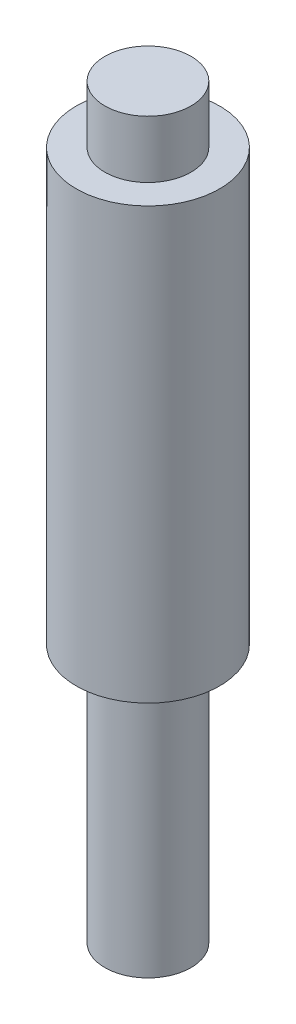
ISO-10303-21;
HEADER;
FILE_DESCRIPTION(('STEP AP214'),'2;1');
FILE_NAME('part.step','',(''),(''),'','','');
FILE_SCHEMA(('AUTOMOTIVE_DESIGN { 1 0 10303 214 1 1 1 1 }'));
ENDSEC;
DATA;
#1=APPLICATION_CONTEXT('core data for automotive mechanical design processes');
#2=APPLICATION_PROTOCOL_DEFINITION('international standard','automotive_design',2000,#1);
#3=PRODUCT_CONTEXT('',#1,'mechanical');
#4=PRODUCT('Part','Part','',(#3));
#5=PRODUCT_RELATED_PRODUCT_CATEGORY('part','',(#4));
#6=PRODUCT_DEFINITION_FORMATION('','',#4);
#7=PRODUCT_DEFINITION_CONTEXT('part definition',#1,'design');
#8=PRODUCT_DEFINITION('design','',#6,#7);
#9=PRODUCT_DEFINITION_SHAPE('','',#8);
#10=(LENGTH_UNIT() NAMED_UNIT(*) SI_UNIT(.MILLI.,.METRE.));
#11=(NAMED_UNIT(*) PLANE_ANGLE_UNIT() SI_UNIT($,.RADIAN.));
#12=(NAMED_UNIT(*) SI_UNIT($,.STERADIAN.) SOLID_ANGLE_UNIT());
#13=UNCERTAINTY_MEASURE_WITH_UNIT(LENGTH_MEASURE(1.E-05),#10,'distance_accuracy_value','');
#14=(GEOMETRIC_REPRESENTATION_CONTEXT(3) GLOBAL_UNCERTAINTY_ASSIGNED_CONTEXT((#13)) GLOBAL_UNIT_ASSIGNED_CONTEXT((#10,
#11,#12)) REPRESENTATION_CONTEXT('',''));
#15=CARTESIAN_POINT('',(0.,0.,0.));
#16=DIRECTION('',(0.,0.,1.));
#17=DIRECTION('',(1.,0.,0.));
#18=AXIS2_PLACEMENT_3D('',#15,#16,#17);
#19=CARTESIAN_POINT('',(-1.5,-11.6600942769009,0.));
#20=DIRECTION('',(0.,1.,0.));
#21=DIRECTION('',(-1.,0.,0.));
#22=AXIS2_PLACEMENT_3D('',#19,#20,#21);
#23=PLANE('',#22);
#24=CARTESIAN_POINT('',(0.,-11.6600942769009,0.));
#25=DIRECTION('',(0.,1.,0.));
#26=DIRECTION('',(-1.,0.,0.));
#27=AXIS2_PLACEMENT_3D('',#24,#25,#26);
#28=CIRCLE('',#27,1.5);
#29=CARTESIAN_POINT('',(-1.5,-11.6600942769009,0.));
#30=VERTEX_POINT('',#29);
#31=EDGE_CURVE('E59',#30,#30,#28,.T.);
#32=ORIENTED_EDGE('',*,*,#31,.T.);
#33=EDGE_LOOP('',(#32));
#34=FACE_BOUND('',#33,.T.);
#35=ADVANCED_FACE('F37',(#34),#23,.T.);
#36=CARTESIAN_POINT('',(0.,-37.6600942769009,0.));
#37=DIRECTION('',(0.,-1.,0.));
#38=DIRECTION('',(1.,0.,0.));
#39=AXIS2_PLACEMENT_3D('',#36,#37,#38);
#40=PLANE('',#39);
#41=CARTESIAN_POINT('',(0.,-37.6600942769009,0.));
#42=DIRECTION('',(0.,1.,0.));
#43=DIRECTION('',(-1.,0.,0.));
#44=AXIS2_PLACEMENT_3D('',#41,#42,#43);
#45=CIRCLE('',#44,1.5);
#46=CARTESIAN_POINT('',(-1.49999999999999,-37.6600942769009,0.));
#47=VERTEX_POINT('',#46);
#48=EDGE_CURVE('E10',#47,#47,#45,.T.);
#49=ORIENTED_EDGE('',*,*,#48,.F.);
#50=EDGE_LOOP('',(#49));
#51=FACE_BOUND('',#50,.T.);
#52=ADVANCED_FACE('F76',(#51),#40,.T.);
#53=CARTESIAN_POINT('',(0.,-11.6600942769009,0.));
#54=DIRECTION('',(0.,1.,0.));
#55=DIRECTION('',(-1.,0.,0.));
#56=AXIS2_PLACEMENT_3D('',#53,#54,#55);
#57=CYLINDRICAL_SURFACE('',#56,1.5);
#58=ORIENTED_EDGE('',*,*,#48,.T.);
#59=EDGE_LOOP('',(#58));
#60=FACE_BOUND('',#59,.T.);
#61=CARTESIAN_POINT('',(0.,-28.6600942769009,0.));
#62=DIRECTION('',(0.,1.,0.));
#63=DIRECTION('',(-1.,0.,0.));
#64=AXIS2_PLACEMENT_3D('',#61,#62,#63);
#65=CIRCLE('',#64,1.5);
#66=CARTESIAN_POINT('',(-1.5,-28.6600942769009,0.));
#67=VERTEX_POINT('',#66);
#68=EDGE_CURVE('E43',#67,#67,#65,.T.);
#69=ORIENTED_EDGE('',*,*,#68,.F.);
#70=EDGE_LOOP('',(#69));
#71=FACE_BOUND('',#70,.T.);
#72=ADVANCED_FACE('F80',(#60,#71),#57,.T.);
#73=CARTESIAN_POINT('',(-1.5,-28.6600942769009,0.));
#74=DIRECTION('',(0.,-1.,0.));
#75=DIRECTION('',(1.,0.,0.));
#76=AXIS2_PLACEMENT_3D('',#73,#74,#75);
#77=PLANE('',#76);
#78=ORIENTED_EDGE('',*,*,#68,.T.);
#79=EDGE_LOOP('',(#78));
#80=FACE_BOUND('',#79,.T.);
#81=CARTESIAN_POINT('',(0.,-28.6600942769009,0.));
#82=DIRECTION('',(0.,1.,0.));
#83=DIRECTION('',(-1.,0.,0.));
#84=AXIS2_PLACEMENT_3D('',#81,#82,#83);
#85=CIRCLE('',#84,2.5);
#86=CARTESIAN_POINT('',(-2.5,-28.6600942769009,0.));
#87=VERTEX_POINT('',#86);
#88=EDGE_CURVE('E47',#87,#87,#85,.T.);
#89=ORIENTED_EDGE('',*,*,#88,.F.);
#90=EDGE_LOOP('',(#89));
#91=FACE_BOUND('',#90,.T.);
#92=ADVANCED_FACE('F85',(#80,#91),#77,.T.);
#93=CARTESIAN_POINT('',(0.,-11.6600942769009,0.));
#94=DIRECTION('',(0.,1.,0.));
#95=DIRECTION('',(-1.,0.,0.));
#96=AXIS2_PLACEMENT_3D('',#93,#94,#95);
#97=CYLINDRICAL_SURFACE('',#96,2.5);
#98=ORIENTED_EDGE('',*,*,#88,.T.);
#99=EDGE_LOOP('',(#98));
#100=FACE_BOUND('',#99,.T.);
#101=CARTESIAN_POINT('',(0.,-13.6600942769009,0.));
#102=DIRECTION('',(0.,1.,0.));
#103=DIRECTION('',(-1.,0.,0.));
#104=AXIS2_PLACEMENT_3D('',#101,#102,#103);
#105=CIRCLE('',#104,2.5);
#106=CARTESIAN_POINT('',(-2.5,-13.6600942769009,0.));
#107=VERTEX_POINT('',#106);
#108=EDGE_CURVE('E51',#107,#107,#105,.T.);
#109=ORIENTED_EDGE('',*,*,#108,.F.);
#110=EDGE_LOOP('',(#109));
#111=FACE_BOUND('',#110,.T.);
#112=ADVANCED_FACE('F72',(#100,#111),#97,.T.);
#113=CARTESIAN_POINT('',(-2.5,-13.6600942769009,0.));
#114=DIRECTION('',(0.,1.,0.));
#115=DIRECTION('',(-1.,0.,0.));
#116=AXIS2_PLACEMENT_3D('',#113,#114,#115);
#117=PLANE('',#116);
#118=ORIENTED_EDGE('',*,*,#108,.T.);
#119=EDGE_LOOP('',(#118));
#120=FACE_BOUND('',#119,.T.);
#121=CARTESIAN_POINT('',(0.,-13.6600942769009,0.));
#122=DIRECTION('',(0.,1.,0.));
#123=DIRECTION('',(-1.,0.,0.));
#124=AXIS2_PLACEMENT_3D('',#121,#122,#123);
#125=CIRCLE('',#124,1.5);
#126=CARTESIAN_POINT('',(-1.5,-13.6600942769009,0.));
#127=VERTEX_POINT('',#126);
#128=EDGE_CURVE('E56',#127,#127,#125,.T.);
#129=ORIENTED_EDGE('',*,*,#128,.F.);
#130=EDGE_LOOP('',(#129));
#131=FACE_BOUND('',#130,.T.);
#132=ADVANCED_FACE('F66',(#120,#131),#117,.T.);
#133=CARTESIAN_POINT('',(0.,-11.6600942769009,0.));
#134=DIRECTION('',(0.,1.,0.));
#135=DIRECTION('',(-1.,0.,0.));
#136=AXIS2_PLACEMENT_3D('',#133,#134,#135);
#137=CYLINDRICAL_SURFACE('',#136,1.5);
#138=ORIENTED_EDGE('',*,*,#128,.T.);
#139=EDGE_LOOP('',(#138));
#140=FACE_BOUND('',#139,.T.);
#141=ORIENTED_EDGE('',*,*,#31,.F.);
#142=EDGE_LOOP('',(#141));
#143=FACE_BOUND('',#142,.T.);
#144=ADVANCED_FACE('F64',(#140,#143),#137,.T.);
#145=CLOSED_SHELL('',(#35,#52,#72,#92,#112,#132,#144));
#146=MANIFOLD_SOLID_BREP('B2',#145);
#147=ADVANCED_BREP_SHAPE_REPRESENTATION('',(#18,#146),#14);
#148=SHAPE_DEFINITION_REPRESENTATION(#9,#147);
ENDSEC;
END-ISO-10303-21;
